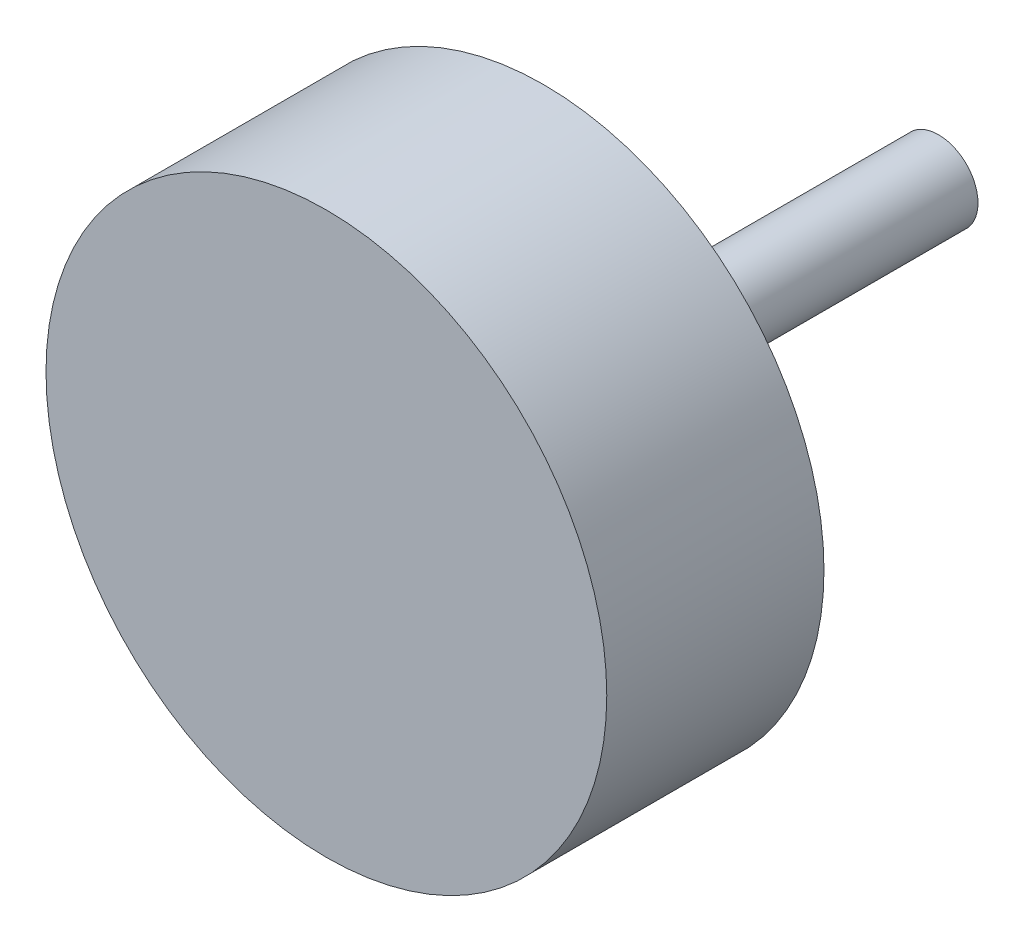
ISO-10303-21;
HEADER;
FILE_DESCRIPTION(('STEP AP214'),'2;1');
FILE_NAME('part.step','',(''),(''),'','','');
FILE_SCHEMA(('AUTOMOTIVE_DESIGN { 1 0 10303 214 1 1 1 1 }'));
ENDSEC;
DATA;
#1=APPLICATION_CONTEXT('core data for automotive mechanical design processes');
#2=APPLICATION_PROTOCOL_DEFINITION('international standard','automotive_design',2000,#1);
#3=PRODUCT_CONTEXT('',#1,'mechanical');
#4=PRODUCT('Part','Part','',(#3));
#5=PRODUCT_RELATED_PRODUCT_CATEGORY('part','',(#4));
#6=PRODUCT_DEFINITION_FORMATION('','',#4);
#7=PRODUCT_DEFINITION_CONTEXT('part definition',#1,'design');
#8=PRODUCT_DEFINITION('design','',#6,#7);
#9=PRODUCT_DEFINITION_SHAPE('','',#8);
#10=(LENGTH_UNIT() NAMED_UNIT(*) SI_UNIT(.MILLI.,.METRE.));
#11=(NAMED_UNIT(*) PLANE_ANGLE_UNIT() SI_UNIT($,.RADIAN.));
#12=(NAMED_UNIT(*) SI_UNIT($,.STERADIAN.) SOLID_ANGLE_UNIT());
#13=UNCERTAINTY_MEASURE_WITH_UNIT(LENGTH_MEASURE(1.E-05),#10,'distance_accuracy_value','');
#14=(GEOMETRIC_REPRESENTATION_CONTEXT(3) GLOBAL_UNCERTAINTY_ASSIGNED_CONTEXT((#13)) GLOBAL_UNIT_ASSIGNED_CONTEXT((#10,
#11,#12)) REPRESENTATION_CONTEXT('',''));
#15=CARTESIAN_POINT('',(0.,0.,0.));
#16=DIRECTION('',(0.,0.,1.));
#17=DIRECTION('',(1.,0.,0.));
#18=AXIS2_PLACEMENT_3D('',#15,#16,#17);
#19=CARTESIAN_POINT('',(0.,0.,5.5));
#20=DIRECTION('',(0.,0.,-1.));
#21=DIRECTION('',(-1.,0.,0.));
#22=AXIS2_PLACEMENT_3D('',#19,#20,#21);
#23=CYLINDRICAL_SURFACE('',#22,7.1);
#24=CARTESIAN_POINT('',(0.,0.,5.5));
#25=DIRECTION('',(0.,0.,1.));
#26=DIRECTION('',(1.,0.,0.));
#27=AXIS2_PLACEMENT_3D('',#24,#25,#26);
#28=CIRCLE('',#27,7.1);
#29=CARTESIAN_POINT('',(7.1,0.,5.5));
#30=VERTEX_POINT('',#29);
#31=EDGE_CURVE('E36',#30,#30,#28,.T.);
#32=ORIENTED_EDGE('',*,*,#31,.F.);
#33=EDGE_LOOP('',(#32));
#34=FACE_BOUND('',#33,.T.);
#35=CARTESIAN_POINT('',(0.,0.,0.));
#36=DIRECTION('',(0.,0.,1.));
#37=DIRECTION('',(1.,0.,0.));
#38=AXIS2_PLACEMENT_3D('',#35,#36,#37);
#39=CIRCLE('',#38,7.1);
#40=CARTESIAN_POINT('',(7.1,0.,0.));
#41=VERTEX_POINT('',#40);
#42=EDGE_CURVE('E40',#41,#41,#39,.T.);
#43=ORIENTED_EDGE('',*,*,#42,.T.);
#44=EDGE_LOOP('',(#43));
#45=FACE_BOUND('',#44,.T.);
#46=ADVANCED_FACE('F30',(#34,#45),#23,.T.);
#47=CARTESIAN_POINT('',(0.,0.,5.5));
#48=DIRECTION('',(0.,0.,1.));
#49=DIRECTION('',(1.,0.,0.));
#50=AXIS2_PLACEMENT_3D('',#47,#48,#49);
#51=PLANE('',#50);
#52=ORIENTED_EDGE('',*,*,#31,.T.);
#53=EDGE_LOOP('',(#52));
#54=FACE_BOUND('',#53,.T.);
#55=ADVANCED_FACE('F61',(#54),#51,.T.);
#56=CARTESIAN_POINT('',(0.,0.,0.));
#57=DIRECTION('',(0.,0.,1.));
#58=DIRECTION('',(1.,0.,0.));
#59=AXIS2_PLACEMENT_3D('',#56,#57,#58);
#60=PLANE('',#59);
#61=CARTESIAN_POINT('',(0.,0.,0.));
#62=DIRECTION('',(0.,0.,1.));
#63=DIRECTION('',(1.,0.,0.));
#64=AXIS2_PLACEMENT_3D('',#61,#62,#63);
#65=CIRCLE('',#64,1.);
#66=CARTESIAN_POINT('',(1.,0.,0.));
#67=VERTEX_POINT('',#66);
#68=EDGE_CURVE('E10',#67,#67,#65,.F.);
#69=ORIENTED_EDGE('',*,*,#68,.F.);
#70=EDGE_LOOP('',(#69));
#71=FACE_BOUND('',#70,.T.);
#72=ORIENTED_EDGE('',*,*,#42,.F.);
#73=EDGE_LOOP('',(#72));
#74=FACE_BOUND('',#73,.T.);
#75=ADVANCED_FACE('F54',(#71,#74),#60,.F.);
#76=CARTESIAN_POINT('',(0.,0.,-10.));
#77=DIRECTION('',(0.,0.,1.));
#78=DIRECTION('',(1.,0.,0.));
#79=AXIS2_PLACEMENT_3D('',#76,#77,#78);
#80=CYLINDRICAL_SURFACE('',#79,1.);
#81=CARTESIAN_POINT('',(0.,0.,-10.));
#82=DIRECTION('',(0.,0.,-1.));
#83=DIRECTION('',(-1.,0.,0.));
#84=AXIS2_PLACEMENT_3D('',#81,#82,#83);
#85=CIRCLE('',#84,1.);
#86=CARTESIAN_POINT('',(-1.,0.,-10.));
#87=VERTEX_POINT('',#86);
#88=EDGE_CURVE('E45',#87,#87,#85,.T.);
#89=ORIENTED_EDGE('',*,*,#88,.F.);
#90=EDGE_LOOP('',(#89));
#91=FACE_BOUND('',#90,.T.);
#92=ORIENTED_EDGE('',*,*,#68,.T.);
#93=EDGE_LOOP('',(#92));
#94=FACE_BOUND('',#93,.T.);
#95=ADVANCED_FACE('F52',(#91,#94),#80,.T.);
#96=CARTESIAN_POINT('',(0.,0.,-10.));
#97=DIRECTION('',(0.,0.,-1.));
#98=DIRECTION('',(-1.,0.,0.));
#99=AXIS2_PLACEMENT_3D('',#96,#97,#98);
#100=PLANE('',#99);
#101=ORIENTED_EDGE('',*,*,#88,.T.);
#102=EDGE_LOOP('',(#101));
#103=FACE_BOUND('',#102,.T.);
#104=ADVANCED_FACE('F50',(#103),#100,.T.);
#105=CLOSED_SHELL('',(#46,#55,#75,#95,#104));
#106=MANIFOLD_SOLID_BREP('B2',#105);
#107=ADVANCED_BREP_SHAPE_REPRESENTATION('',(#18,#106),#14);
#108=SHAPE_DEFINITION_REPRESENTATION(#9,#107);
ENDSEC;
END-ISO-10303-21;
